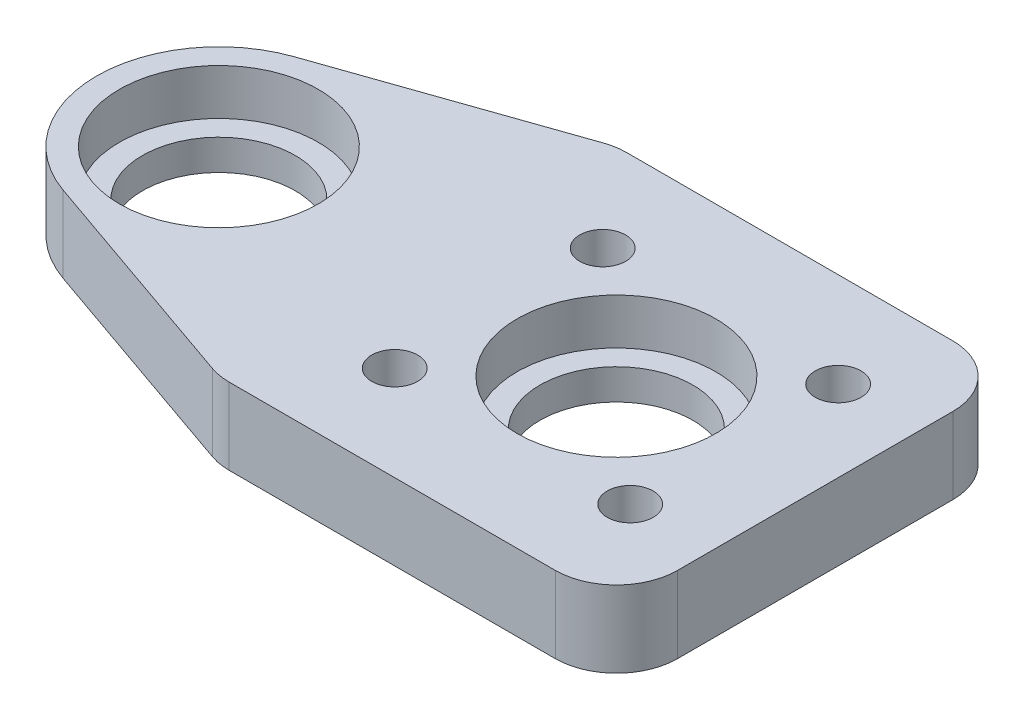
ISO-10303-21;
HEADER;
FILE_DESCRIPTION(('STEP AP214'),'2;1');
FILE_NAME('part.step','',(''),(''),'','','');
FILE_SCHEMA(('AUTOMOTIVE_DESIGN { 1 0 10303 214 1 1 1 1 }'));
ENDSEC;
DATA;
#1=APPLICATION_CONTEXT('core data for automotive mechanical design processes');
#2=APPLICATION_PROTOCOL_DEFINITION('international standard','automotive_design',2000,#1);
#3=PRODUCT_CONTEXT('',#1,'mechanical');
#4=PRODUCT('Part','Part','',(#3));
#5=PRODUCT_RELATED_PRODUCT_CATEGORY('part','',(#4));
#6=PRODUCT_DEFINITION_FORMATION('','',#4);
#7=PRODUCT_DEFINITION_CONTEXT('part definition',#1,'design');
#8=PRODUCT_DEFINITION('design','',#6,#7);
#9=PRODUCT_DEFINITION_SHAPE('','',#8);
#10=(LENGTH_UNIT() NAMED_UNIT(*) SI_UNIT(.MILLI.,.METRE.));
#11=(NAMED_UNIT(*) PLANE_ANGLE_UNIT() SI_UNIT($,.RADIAN.));
#12=(NAMED_UNIT(*) SI_UNIT($,.STERADIAN.) SOLID_ANGLE_UNIT());
#13=UNCERTAINTY_MEASURE_WITH_UNIT(LENGTH_MEASURE(1.E-05),#10,'distance_accuracy_value','');
#14=(GEOMETRIC_REPRESENTATION_CONTEXT(3) GLOBAL_UNCERTAINTY_ASSIGNED_CONTEXT((#13)) GLOBAL_UNIT_ASSIGNED_CONTEXT((#10,
#11,#12)) REPRESENTATION_CONTEXT('',''));
#15=CARTESIAN_POINT('',(0.,0.,0.));
#16=DIRECTION('',(0.,0.,1.));
#17=DIRECTION('',(1.,0.,0.));
#18=AXIS2_PLACEMENT_3D('',#15,#16,#17);
#19=CARTESIAN_POINT('',(-489.11106294102,-180.809804520672,-89.302859510669));
#20=DIRECTION('',(0.,-1.,0.));
#21=DIRECTION('',(0.,0.,-1.));
#22=AXIS2_PLACEMENT_3D('',#19,#20,#21);
#23=CYLINDRICAL_SURFACE('',#22,4.99999999999999);
#24=CARTESIAN_POINT('',(-489.11106294102,-185.809804520672,-89.302859510669));
#25=DIRECTION('',(0.,1.,0.));
#26=DIRECTION('',(0.,0.,1.));
#27=AXIS2_PLACEMENT_3D('',#24,#25,#26);
#28=CIRCLE('',#27,4.99999999999999);
#29=CARTESIAN_POINT('',(-489.11106294102,-185.809804520672,-84.302859510669));
#30=VERTEX_POINT('',#29);
#31=EDGE_CURVE('E163',#30,#30,#28,.T.);
#32=ORIENTED_EDGE('',*,*,#31,.F.);
#33=EDGE_LOOP('',(#32));
#34=FACE_BOUND('',#33,.T.);
#35=CARTESIAN_POINT('',(-489.11106294102,-183.809804520672,-89.302859510669));
#36=DIRECTION('',(0.,1.,0.));
#37=DIRECTION('',(0.,0.,1.));
#38=AXIS2_PLACEMENT_3D('',#35,#36,#37);
#39=CIRCLE('',#38,4.99999999999999);
#40=CARTESIAN_POINT('',(-489.11106294102,-183.809804520672,-84.302859510669));
#41=VERTEX_POINT('',#40);
#42=EDGE_CURVE('E165',#41,#41,#39,.T.);
#43=ORIENTED_EDGE('',*,*,#42,.T.);
#44=EDGE_LOOP('',(#43));
#45=FACE_BOUND('',#44,.T.);
#46=ADVANCED_FACE('F35',(#34,#45),#23,.F.);
#47=CARTESIAN_POINT('',(-463.11106294102,-180.809804520672,-89.302859510669));
#48=DIRECTION('',(0.,-1.,0.));
#49=DIRECTION('',(0.,0.,-1.));
#50=AXIS2_PLACEMENT_3D('',#47,#48,#49);
#51=CYLINDRICAL_SURFACE('',#50,4.99999999999999);
#52=CARTESIAN_POINT('',(-463.11106294102,-185.809804520672,-89.302859510669));
#53=DIRECTION('',(0.,1.,0.));
#54=DIRECTION('',(0.,0.,1.));
#55=AXIS2_PLACEMENT_3D('',#52,#53,#54);
#56=CIRCLE('',#55,4.99999999999999);
#57=CARTESIAN_POINT('',(-463.11106294102,-185.809804520672,-84.302859510669));
#58=VERTEX_POINT('',#57);
#59=EDGE_CURVE('E247',#58,#58,#56,.T.);
#60=ORIENTED_EDGE('',*,*,#59,.F.);
#61=EDGE_LOOP('',(#60));
#62=FACE_BOUND('',#61,.T.);
#63=CARTESIAN_POINT('',(-463.11106294102,-183.809804520672,-89.302859510669));
#64=DIRECTION('',(0.,1.,0.));
#65=DIRECTION('',(0.,0.,1.));
#66=AXIS2_PLACEMENT_3D('',#63,#64,#65);
#67=CIRCLE('',#66,4.99999999999999);
#68=CARTESIAN_POINT('',(-463.11106294102,-183.809804520672,-84.302859510669));
#69=VERTEX_POINT('',#68);
#70=EDGE_CURVE('E160',#69,#69,#67,.T.);
#71=ORIENTED_EDGE('',*,*,#70,.T.);
#72=EDGE_LOOP('',(#71));
#73=FACE_BOUND('',#72,.T.);
#74=ADVANCED_FACE('F275',(#62,#73),#51,.F.);
#75=CARTESIAN_POINT('',(-489.11106294102,-180.809804520672,-89.302859510669));
#76=DIRECTION('',(0.,-1.,0.));
#77=DIRECTION('',(0.,0.,-1.));
#78=AXIS2_PLACEMENT_3D('',#75,#76,#77);
#79=PLANE('',#78);
#80=CARTESIAN_POINT('',(-489.11106294102,-180.809804520672,-89.302859510669));
#81=DIRECTION('',(0.,1.,0.));
#82=DIRECTION('',(0.,0.,1.));
#83=AXIS2_PLACEMENT_3D('',#80,#81,#82);
#84=CIRCLE('',#83,6.50000000000002);
#85=CARTESIAN_POINT('',(-489.11106294102,-180.809804520672,-82.802859510669));
#86=VERTEX_POINT('',#85);
#87=EDGE_CURVE('E258',#86,#86,#84,.T.);
#88=ORIENTED_EDGE('',*,*,#87,.F.);
#89=EDGE_LOOP('',(#88));
#90=FACE_BOUND('',#89,.T.);
#91=CARTESIAN_POINT('',(-463.11106294102,-180.809804520672,-89.302859510669));
#92=DIRECTION('',(0.,1.,0.));
#93=DIRECTION('',(0.,0.,1.));
#94=AXIS2_PLACEMENT_3D('',#91,#92,#93);
#95=CIRCLE('',#94,6.50000000000002);
#96=CARTESIAN_POINT('',(-463.11106294102,-180.809804520672,-82.802859510669));
#97=VERTEX_POINT('',#96);
#98=EDGE_CURVE('E168',#97,#97,#95,.T.);
#99=ORIENTED_EDGE('',*,*,#98,.F.);
#100=EDGE_LOOP('',(#99));
#101=FACE_BOUND('',#100,.T.);
#102=DIRECTION('',(-1.,0.,0.));
#103=VECTOR('',#102,1.);
#104=CARTESIAN_POINT('',(-476.11106294102,-180.809804520672,-102.302859510669));
#105=LINE('',#104,#103);
#106=CARTESIAN_POINT('',(-454.11106294102,-180.809804520672,-102.302859510669));
#107=VERTEX_POINT('',#106);
#108=CARTESIAN_POINT('',(-475.434292764384,-180.809804520672,-102.302859510669));
#109=VERTEX_POINT('',#108);
#110=EDGE_CURVE('E125',#107,#109,#105,.T.);
#111=ORIENTED_EDGE('',*,*,#110,.T.);
#112=CARTESIAN_POINT('',(-475.434292764384,-180.809804520672,-98.302859510669));
#113=DIRECTION('',(0.,-1.,0.));
#114=DIRECTION('',(0.,0.,-1.));
#115=AXIS2_PLACEMENT_3D('',#112,#113,#114);
#116=CIRCLE('',#115,4.);
#117=CARTESIAN_POINT('',(-476.750164810507,-180.809804520672,-102.080223771398));
#118=VERTEX_POINT('',#117);
#119=EDGE_CURVE('E121',#109,#118,#116,.F.);
#120=ORIENTED_EDGE('',*,*,#119,.T.);
#121=DIRECTION('',(-0.944341065182142,0.,0.328968011530997));
#122=VECTOR('',#121,1.);
#123=CARTESIAN_POINT('',(-476.11106294102,-180.809804520672,-102.302859510669));
#124=LINE('',#123,#122);
#125=CARTESIAN_POINT('',(-491.742757588541,-180.809804520672,-96.85744609527));
#126=VERTEX_POINT('',#125);
#127=EDGE_CURVE('E111',#118,#126,#124,.T.);
#128=ORIENTED_EDGE('',*,*,#127,.T.);
#129=CARTESIAN_POINT('',(-489.11106294102,-180.809804520672,-89.302859510669));
#130=DIRECTION('',(0.,1.,0.));
#131=DIRECTION('',(0.,0.,-1.));
#132=AXIS2_PLACEMENT_3D('',#129,#130,#131);
#133=CIRCLE('',#132,7.99984969746488);
#134=CARTESIAN_POINT('',(-491.742757588541,-180.809804520672,-81.748272926068));
#135=VERTEX_POINT('',#134);
#136=EDGE_CURVE('E118',#126,#135,#133,.T.);
#137=ORIENTED_EDGE('',*,*,#136,.T.);
#138=DIRECTION('',(0.944341065182142,0.,0.328968011530997));
#139=VECTOR('',#138,1.);
#140=CARTESIAN_POINT('',(-476.11106294102,-180.809804520672,-76.302859510669));
#141=LINE('',#140,#139);
#142=CARTESIAN_POINT('',(-476.750164810507,-180.809804520672,-76.5254952499404));
#143=VERTEX_POINT('',#142);
#144=EDGE_CURVE('E158',#135,#143,#141,.T.);
#145=ORIENTED_EDGE('',*,*,#144,.T.);
#146=CARTESIAN_POINT('',(-475.434292764384,-180.809804520672,-80.302859510669));
#147=DIRECTION('',(0.,-1.,0.));
#148=DIRECTION('',(0.,0.,-1.));
#149=AXIS2_PLACEMENT_3D('',#146,#147,#148);
#150=CIRCLE('',#149,4.);
#151=CARTESIAN_POINT('',(-475.434292764384,-180.809804520672,-76.302859510669));
#152=VERTEX_POINT('',#151);
#153=EDGE_CURVE('E184',#143,#152,#150,.F.);
#154=ORIENTED_EDGE('',*,*,#153,.T.);
#155=DIRECTION('',(1.,0.,0.));
#156=VECTOR('',#155,1.);
#157=CARTESIAN_POINT('',(-450.11106294102,-180.809804520672,-76.302859510669));
#158=LINE('',#157,#156);
#159=CARTESIAN_POINT('',(-454.11106294102,-180.809804520672,-76.302859510669));
#160=VERTEX_POINT('',#159);
#161=EDGE_CURVE('E200',#152,#160,#158,.T.);
#162=ORIENTED_EDGE('',*,*,#161,.T.);
#163=CARTESIAN_POINT('',(-454.11106294102,-180.809804520672,-80.302859510669));
#164=DIRECTION('',(0.,-1.,0.));
#165=DIRECTION('',(0.,0.,-1.));
#166=AXIS2_PLACEMENT_3D('',#163,#164,#165);
#167=CIRCLE('',#166,4.);
#168=CARTESIAN_POINT('',(-450.11106294102,-180.809804520672,-80.302859510669));
#169=VERTEX_POINT('',#168);
#170=EDGE_CURVE('E57',#160,#169,#167,.F.);
#171=ORIENTED_EDGE('',*,*,#170,.T.);
#172=DIRECTION('',(0.,0.,-1.));
#173=VECTOR('',#172,1.);
#174=CARTESIAN_POINT('',(-450.11106294102,-180.809804520672,-89.302859510669));
#175=LINE('',#174,#173);
#176=CARTESIAN_POINT('',(-450.11106294102,-180.809804520672,-98.302859510669));
#177=VERTEX_POINT('',#176);
#178=EDGE_CURVE('E205',#169,#177,#175,.T.);
#179=ORIENTED_EDGE('',*,*,#178,.T.);
#180=CARTESIAN_POINT('',(-454.11106294102,-180.809804520672,-98.302859510669));
#181=DIRECTION('',(0.,-1.,0.));
#182=DIRECTION('',(0.,0.,-1.));
#183=AXIS2_PLACEMENT_3D('',#180,#181,#182);
#184=CIRCLE('',#183,4.);
#185=EDGE_CURVE('E187',#177,#107,#184,.F.);
#186=ORIENTED_EDGE('',*,*,#185,.T.);
#187=EDGE_LOOP('',(#111,#120,#128,#137,#145,#154,#162,#171,#179,#186));
#188=FACE_BOUND('',#187,.T.);
#189=CARTESIAN_POINT('',(-470.81106294102,-180.809804520672,-96.102859510669));
#190=DIRECTION('',(0.,1.,0.));
#191=DIRECTION('',(0.,0.,1.));
#192=AXIS2_PLACEMENT_3D('',#189,#190,#191);
#193=CIRCLE('',#192,1.50000000000002);
#194=CARTESIAN_POINT('',(-470.81106294102,-180.809804520672,-94.602859510669));
#195=VERTEX_POINT('',#194);
#196=EDGE_CURVE('E148',#195,#195,#193,.T.);
#197=ORIENTED_EDGE('',*,*,#196,.F.);
#198=EDGE_LOOP('',(#197));
#199=FACE_BOUND('',#198,.T.);
#200=CARTESIAN_POINT('',(-455.41106294102,-180.809804520672,-96.102859510669));
#201=DIRECTION('',(0.,1.,0.));
#202=DIRECTION('',(0.,0.,1.));
#203=AXIS2_PLACEMENT_3D('',#200,#201,#202);
#204=CIRCLE('',#203,1.49999999999997);
#205=CARTESIAN_POINT('',(-455.41106294102,-180.809804520672,-94.602859510669));
#206=VERTEX_POINT('',#205);
#207=EDGE_CURVE('E229',#206,#206,#204,.T.);
#208=ORIENTED_EDGE('',*,*,#207,.F.);
#209=EDGE_LOOP('',(#208));
#210=FACE_BOUND('',#209,.T.);
#211=CARTESIAN_POINT('',(-455.41106294102,-180.809804520672,-82.502859510669));
#212=DIRECTION('',(0.,1.,0.));
#213=DIRECTION('',(0.,0.,1.));
#214=AXIS2_PLACEMENT_3D('',#211,#212,#213);
#215=CIRCLE('',#214,1.50000000000002);
#216=CARTESIAN_POINT('',(-455.41106294102,-180.809804520672,-81.002859510669));
#217=VERTEX_POINT('',#216);
#218=EDGE_CURVE('E235',#217,#217,#215,.T.);
#219=ORIENTED_EDGE('',*,*,#218,.F.);
#220=EDGE_LOOP('',(#219));
#221=FACE_BOUND('',#220,.T.);
#222=CARTESIAN_POINT('',(-470.81106294102,-180.809804520672,-82.502859510669));
#223=DIRECTION('',(0.,1.,0.));
#224=DIRECTION('',(0.,0.,1.));
#225=AXIS2_PLACEMENT_3D('',#222,#223,#224);
#226=CIRCLE('',#225,1.50000000000002);
#227=CARTESIAN_POINT('',(-470.81106294102,-180.809804520672,-81.002859510669));
#228=VERTEX_POINT('',#227);
#229=EDGE_CURVE('E241',#228,#228,#226,.T.);
#230=ORIENTED_EDGE('',*,*,#229,.F.);
#231=EDGE_LOOP('',(#230));
#232=FACE_BOUND('',#231,.T.);
#233=ADVANCED_FACE('F114',(#90,#101,#188,#199,#210,#221,#232),#79,.F.);
#234=CARTESIAN_POINT('',(-489.11106294102,-185.809804520672,-89.302859510669));
#235=DIRECTION('',(0.,-1.,0.));
#236=DIRECTION('',(0.,0.,-1.));
#237=AXIS2_PLACEMENT_3D('',#234,#235,#236);
#238=PLANE('',#237);
#239=ORIENTED_EDGE('',*,*,#59,.T.);
#240=EDGE_LOOP('',(#239));
#241=FACE_BOUND('',#240,.T.);
#242=CARTESIAN_POINT('',(-455.41106294102,-185.809804520672,-82.502859510669));
#243=DIRECTION('',(0.,1.,0.));
#244=DIRECTION('',(0.,0.,1.));
#245=AXIS2_PLACEMENT_3D('',#242,#243,#244);
#246=CIRCLE('',#245,1.50000000000002);
#247=CARTESIAN_POINT('',(-455.41106294102,-185.809804520672,-81.002859510669));
#248=VERTEX_POINT('',#247);
#249=EDGE_CURVE('E238',#248,#248,#246,.T.);
#250=ORIENTED_EDGE('',*,*,#249,.T.);
#251=EDGE_LOOP('',(#250));
#252=FACE_BOUND('',#251,.T.);
#253=CARTESIAN_POINT('',(-470.81106294102,-185.809804520672,-96.102859510669));
#254=DIRECTION('',(0.,1.,0.));
#255=DIRECTION('',(0.,0.,1.));
#256=AXIS2_PLACEMENT_3D('',#253,#254,#255);
#257=CIRCLE('',#256,1.50000000000002);
#258=CARTESIAN_POINT('',(-470.81106294102,-185.809804520672,-94.602859510669));
#259=VERTEX_POINT('',#258);
#260=EDGE_CURVE('E226',#259,#259,#257,.T.);
#261=ORIENTED_EDGE('',*,*,#260,.T.);
#262=EDGE_LOOP('',(#261));
#263=FACE_BOUND('',#262,.T.);
#264=DIRECTION('',(-0.944341065182142,0.,0.328968011530997));
#265=VECTOR('',#264,1.);
#266=CARTESIAN_POINT('',(-476.11106294102,-185.809804520672,-102.302859510669));
#267=LINE('',#266,#265);
#268=CARTESIAN_POINT('',(-476.750164810507,-185.809804520672,-102.080223771398));
#269=VERTEX_POINT('',#268);
#270=CARTESIAN_POINT('',(-491.742757588541,-185.809804520672,-96.85744609527));
#271=VERTEX_POINT('',#270);
#272=EDGE_CURVE('E131',#269,#271,#267,.T.);
#273=ORIENTED_EDGE('',*,*,#272,.F.);
#274=CARTESIAN_POINT('',(-475.434292764384,-185.809804520672,-98.302859510669));
#275=DIRECTION('',(0.,-1.,0.));
#276=DIRECTION('',(0.,0.,-1.));
#277=AXIS2_PLACEMENT_3D('',#274,#275,#276);
#278=CIRCLE('',#277,4.);
#279=CARTESIAN_POINT('',(-475.434292764384,-185.809804520672,-102.302859510669));
#280=VERTEX_POINT('',#279);
#281=EDGE_CURVE('E177',#269,#280,#278,.T.);
#282=ORIENTED_EDGE('',*,*,#281,.T.);
#283=DIRECTION('',(-1.,0.,0.));
#284=VECTOR('',#283,1.);
#285=CARTESIAN_POINT('',(-476.11106294102,-185.809804520672,-102.302859510669));
#286=LINE('',#285,#284);
#287=CARTESIAN_POINT('',(-454.11106294102,-185.809804520672,-102.302859510669));
#288=VERTEX_POINT('',#287);
#289=EDGE_CURVE('E153',#288,#280,#286,.T.);
#290=ORIENTED_EDGE('',*,*,#289,.F.);
#291=CARTESIAN_POINT('',(-454.11106294102,-185.809804520672,-98.302859510669));
#292=DIRECTION('',(0.,-1.,0.));
#293=DIRECTION('',(0.,0.,-1.));
#294=AXIS2_PLACEMENT_3D('',#291,#292,#293);
#295=CIRCLE('',#294,4.);
#296=CARTESIAN_POINT('',(-450.11106294102,-185.809804520672,-98.302859510669));
#297=VERTEX_POINT('',#296);
#298=EDGE_CURVE('E175',#288,#297,#295,.T.);
#299=ORIENTED_EDGE('',*,*,#298,.T.);
#300=DIRECTION('',(0.,0.,-1.));
#301=VECTOR('',#300,1.);
#302=CARTESIAN_POINT('',(-450.11106294102,-185.809804520672,-102.302859510669));
#303=LINE('',#302,#301);
#304=CARTESIAN_POINT('',(-450.11106294102,-185.809804520672,-80.302859510669));
#305=VERTEX_POINT('',#304);
#306=EDGE_CURVE('E151',#305,#297,#303,.T.);
#307=ORIENTED_EDGE('',*,*,#306,.F.);
#308=CARTESIAN_POINT('',(-454.11106294102,-185.809804520672,-80.302859510669));
#309=DIRECTION('',(0.,-1.,0.));
#310=DIRECTION('',(0.,0.,-1.));
#311=AXIS2_PLACEMENT_3D('',#308,#309,#310);
#312=CIRCLE('',#311,4.);
#313=CARTESIAN_POINT('',(-454.11106294102,-185.809804520672,-76.302859510669));
#314=VERTEX_POINT('',#313);
#315=EDGE_CURVE('E173',#305,#314,#312,.T.);
#316=ORIENTED_EDGE('',*,*,#315,.T.);
#317=DIRECTION('',(1.,0.,0.));
#318=VECTOR('',#317,1.);
#319=CARTESIAN_POINT('',(-450.11106294102,-185.809804520672,-76.302859510669));
#320=LINE('',#319,#318);
#321=CARTESIAN_POINT('',(-475.434292764384,-185.809804520672,-76.302859510669));
#322=VERTEX_POINT('',#321);
#323=EDGE_CURVE('E147',#322,#314,#320,.T.);
#324=ORIENTED_EDGE('',*,*,#323,.F.);
#325=CARTESIAN_POINT('',(-475.434292764384,-185.809804520672,-80.302859510669));
#326=DIRECTION('',(0.,-1.,0.));
#327=DIRECTION('',(0.,0.,-1.));
#328=AXIS2_PLACEMENT_3D('',#325,#326,#327);
#329=CIRCLE('',#328,4.);
#330=CARTESIAN_POINT('',(-476.750164810507,-185.809804520672,-76.5254952499404));
#331=VERTEX_POINT('',#330);
#332=EDGE_CURVE('E171',#322,#331,#329,.T.);
#333=ORIENTED_EDGE('',*,*,#332,.T.);
#334=DIRECTION('',(0.944341065182142,0.,0.328968011530997));
#335=VECTOR('',#334,1.);
#336=CARTESIAN_POINT('',(-476.11106294102,-185.809804520672,-76.302859510669));
#337=LINE('',#336,#335);
#338=CARTESIAN_POINT('',(-491.742757588541,-185.809804520672,-81.748272926068));
#339=VERTEX_POINT('',#338);
#340=EDGE_CURVE('E144',#339,#331,#337,.T.);
#341=ORIENTED_EDGE('',*,*,#340,.F.);
#342=CARTESIAN_POINT('',(-489.11106294102,-185.809804520672,-89.302859510669));
#343=DIRECTION('',(0.,1.,0.));
#344=DIRECTION('',(0.,0.,-1.));
#345=AXIS2_PLACEMENT_3D('',#342,#343,#344);
#346=CIRCLE('',#345,7.99984969746488);
#347=EDGE_CURVE('E157',#271,#339,#346,.T.);
#348=ORIENTED_EDGE('',*,*,#347,.F.);
#349=EDGE_LOOP('',(#273,#282,#290,#299,#307,#316,#324,#333,#341,#348));
#350=FACE_BOUND('',#349,.T.);
#351=CARTESIAN_POINT('',(-455.41106294102,-185.809804520672,-96.102859510669));
#352=DIRECTION('',(0.,1.,0.));
#353=DIRECTION('',(0.,0.,1.));
#354=AXIS2_PLACEMENT_3D('',#351,#352,#353);
#355=CIRCLE('',#354,1.49999999999997);
#356=CARTESIAN_POINT('',(-455.41106294102,-185.809804520672,-94.602859510669));
#357=VERTEX_POINT('',#356);
#358=EDGE_CURVE('E232',#357,#357,#355,.T.);
#359=ORIENTED_EDGE('',*,*,#358,.T.);
#360=EDGE_LOOP('',(#359));
#361=FACE_BOUND('',#360,.T.);
#362=CARTESIAN_POINT('',(-470.81106294102,-185.809804520672,-82.502859510669));
#363=DIRECTION('',(0.,1.,0.));
#364=DIRECTION('',(0.,0.,1.));
#365=AXIS2_PLACEMENT_3D('',#362,#363,#364);
#366=CIRCLE('',#365,1.50000000000002);
#367=CARTESIAN_POINT('',(-470.81106294102,-185.809804520672,-81.002859510669));
#368=VERTEX_POINT('',#367);
#369=EDGE_CURVE('E244',#368,#368,#366,.T.);
#370=ORIENTED_EDGE('',*,*,#369,.T.);
#371=EDGE_LOOP('',(#370));
#372=FACE_BOUND('',#371,.T.);
#373=ORIENTED_EDGE('',*,*,#31,.T.);
#374=EDGE_LOOP('',(#373));
#375=FACE_BOUND('',#374,.T.);
#376=ADVANCED_FACE('F212',(#241,#252,#263,#350,#361,#372,#375),#238,.T.);
#377=CARTESIAN_POINT('',(-476.11106294102,-180.809804520672,-76.302859510669));
#378=DIRECTION('',(0.328968011530997,0.,-0.944341065182142));
#379=DIRECTION('',(-0.944341065182142,0.,-0.328968011530997));
#380=AXIS2_PLACEMENT_3D('',#377,#378,#379);
#381=PLANE('',#380);
#382=ORIENTED_EDGE('',*,*,#340,.T.);
#383=DIRECTION('',(0.,-1.,0.));
#384=VECTOR('',#383,1.);
#385=CARTESIAN_POINT('',(-476.750164810507,-180.809804520672,-76.5254952499404));
#386=LINE('',#385,#384);
#387=EDGE_CURVE('E11',#331,#143,#386,.F.);
#388=ORIENTED_EDGE('',*,*,#387,.T.);
#389=ORIENTED_EDGE('',*,*,#144,.F.);
#390=DIRECTION('',(0.,-1.,0.));
#391=VECTOR('',#390,1.);
#392=CARTESIAN_POINT('',(-491.742757588541,-180.809804520672,-81.748272926068));
#393=LINE('',#392,#391);
#394=EDGE_CURVE('E135',#135,#339,#393,.T.);
#395=ORIENTED_EDGE('',*,*,#394,.T.);
#396=EDGE_LOOP('',(#382,#388,#389,#395));
#397=FACE_BOUND('',#396,.T.);
#398=ADVANCED_FACE('F318',(#397),#381,.F.);
#399=CARTESIAN_POINT('',(-450.11106294102,-180.809804520672,-76.302859510669));
#400=DIRECTION('',(0.,0.,-1.));
#401=DIRECTION('',(-1.,0.,0.));
#402=AXIS2_PLACEMENT_3D('',#399,#400,#401);
#403=PLANE('',#402);
#404=ORIENTED_EDGE('',*,*,#323,.T.);
#405=DIRECTION('',(0.,-1.,0.));
#406=VECTOR('',#405,1.);
#407=CARTESIAN_POINT('',(-454.11106294102,-180.809804520672,-76.302859510669));
#408=LINE('',#407,#406);
#409=EDGE_CURVE('E43',#314,#160,#408,.F.);
#410=ORIENTED_EDGE('',*,*,#409,.T.);
#411=ORIENTED_EDGE('',*,*,#161,.F.);
#412=DIRECTION('',(0.,-1.,0.));
#413=VECTOR('',#412,1.);
#414=CARTESIAN_POINT('',(-475.434292764384,-180.809804520672,-76.302859510669));
#415=LINE('',#414,#413);
#416=EDGE_CURVE('E194',#152,#322,#415,.T.);
#417=ORIENTED_EDGE('',*,*,#416,.T.);
#418=EDGE_LOOP('',(#404,#410,#411,#417));
#419=FACE_BOUND('',#418,.T.);
#420=ADVANCED_FACE('F199',(#419),#403,.F.);
#421=CARTESIAN_POINT('',(-450.11106294102,-180.809804520672,-102.302859510669));
#422=DIRECTION('',(-1.,0.,0.));
#423=DIRECTION('',(0.,0.,1.));
#424=AXIS2_PLACEMENT_3D('',#421,#422,#423);
#425=PLANE('',#424);
#426=ORIENTED_EDGE('',*,*,#306,.T.);
#427=DIRECTION('',(0.,-1.,0.));
#428=VECTOR('',#427,1.);
#429=CARTESIAN_POINT('',(-450.11106294102,-180.809804520672,-98.302859510669));
#430=LINE('',#429,#428);
#431=EDGE_CURVE('E50',#297,#177,#430,.F.);
#432=ORIENTED_EDGE('',*,*,#431,.T.);
#433=ORIENTED_EDGE('',*,*,#178,.F.);
#434=DIRECTION('',(0.,-1.,0.));
#435=VECTOR('',#434,1.);
#436=CARTESIAN_POINT('',(-450.11106294102,-180.809804520672,-80.302859510669));
#437=LINE('',#436,#435);
#438=EDGE_CURVE('E190',#169,#305,#437,.T.);
#439=ORIENTED_EDGE('',*,*,#438,.T.);
#440=EDGE_LOOP('',(#426,#432,#433,#439));
#441=FACE_BOUND('',#440,.T.);
#442=ADVANCED_FACE('F210',(#441),#425,.F.);
#443=CARTESIAN_POINT('',(-476.11106294102,-180.809804520672,-102.302859510669));
#444=DIRECTION('',(0.,0.,1.));
#445=DIRECTION('',(1.,0.,0.));
#446=AXIS2_PLACEMENT_3D('',#443,#444,#445);
#447=PLANE('',#446);
#448=ORIENTED_EDGE('',*,*,#289,.T.);
#449=DIRECTION('',(0.,-1.,0.));
#450=VECTOR('',#449,1.);
#451=CARTESIAN_POINT('',(-475.434292764384,-180.809804520672,-102.302859510669));
#452=LINE('',#451,#450);
#453=EDGE_CURVE('E182',#280,#109,#452,.F.);
#454=ORIENTED_EDGE('',*,*,#453,.T.);
#455=ORIENTED_EDGE('',*,*,#110,.F.);
#456=DIRECTION('',(0.,-1.,0.));
#457=VECTOR('',#456,1.);
#458=CARTESIAN_POINT('',(-454.11106294102,-180.809804520672,-102.302859510669));
#459=LINE('',#458,#457);
#460=EDGE_CURVE('E179',#107,#288,#459,.T.);
#461=ORIENTED_EDGE('',*,*,#460,.T.);
#462=EDGE_LOOP('',(#448,#454,#455,#461));
#463=FACE_BOUND('',#462,.T.);
#464=ADVANCED_FACE('F221',(#463),#447,.F.);
#465=CARTESIAN_POINT('',(-476.11106294102,-180.809804520672,-102.302859510669));
#466=DIRECTION('',(0.328968011530997,0.,0.944341065182142));
#467=DIRECTION('',(0.944341065182142,0.,-0.328968011530997));
#468=AXIS2_PLACEMENT_3D('',#465,#466,#467);
#469=PLANE('',#468);
#470=ORIENTED_EDGE('',*,*,#127,.F.);
#471=DIRECTION('',(0.,-1.,0.));
#472=VECTOR('',#471,1.);
#473=CARTESIAN_POINT('',(-476.750164810507,-180.809804520672,-102.080223771398));
#474=LINE('',#473,#472);
#475=EDGE_CURVE('E134',#118,#269,#474,.T.);
#476=ORIENTED_EDGE('',*,*,#475,.T.);
#477=ORIENTED_EDGE('',*,*,#272,.T.);
#478=DIRECTION('',(0.,-1.,0.));
#479=VECTOR('',#478,1.);
#480=CARTESIAN_POINT('',(-491.742757588541,-180.809804520672,-96.85744609527));
#481=LINE('',#480,#479);
#482=EDGE_CURVE('E128',#126,#271,#481,.T.);
#483=ORIENTED_EDGE('',*,*,#482,.F.);
#484=EDGE_LOOP('',(#470,#476,#477,#483));
#485=FACE_BOUND('',#484,.T.);
#486=ADVANCED_FACE('F129',(#485),#469,.F.);
#487=CARTESIAN_POINT('',(-489.11106294102,-180.809804520672,-89.302859510669));
#488=DIRECTION('',(0.,-1.,0.));
#489=DIRECTION('',(0.,0.,-1.));
#490=AXIS2_PLACEMENT_3D('',#487,#488,#489);
#491=CYLINDRICAL_SURFACE('',#490,7.99984969746488);
#492=ORIENTED_EDGE('',*,*,#347,.T.);
#493=ORIENTED_EDGE('',*,*,#394,.F.);
#494=ORIENTED_EDGE('',*,*,#136,.F.);
#495=ORIENTED_EDGE('',*,*,#482,.T.);
#496=EDGE_LOOP('',(#492,#493,#494,#495));
#497=FACE_BOUND('',#496,.T.);
#498=ADVANCED_FACE('F137',(#497),#491,.T.);
#499=CARTESIAN_POINT('',(-470.81106294102,-180.809804520672,-96.102859510669));
#500=DIRECTION('',(0.,-1.,0.));
#501=DIRECTION('',(0.,0.,-1.));
#502=AXIS2_PLACEMENT_3D('',#499,#500,#501);
#503=CYLINDRICAL_SURFACE('',#502,1.50000000000002);
#504=ORIENTED_EDGE('',*,*,#196,.T.);
#505=EDGE_LOOP('',(#504));
#506=FACE_BOUND('',#505,.T.);
#507=ORIENTED_EDGE('',*,*,#260,.F.);
#508=EDGE_LOOP('',(#507));
#509=FACE_BOUND('',#508,.T.);
#510=ADVANCED_FACE('F311',(#506,#509),#503,.F.);
#511=CARTESIAN_POINT('',(-455.41106294102,-180.809804520672,-96.102859510669));
#512=DIRECTION('',(0.,-1.,0.));
#513=DIRECTION('',(0.,0.,-1.));
#514=AXIS2_PLACEMENT_3D('',#511,#512,#513);
#515=CYLINDRICAL_SURFACE('',#514,1.49999999999997);
#516=ORIENTED_EDGE('',*,*,#207,.T.);
#517=EDGE_LOOP('',(#516));
#518=FACE_BOUND('',#517,.T.);
#519=ORIENTED_EDGE('',*,*,#358,.F.);
#520=EDGE_LOOP('',(#519));
#521=FACE_BOUND('',#520,.T.);
#522=ADVANCED_FACE('F307',(#518,#521),#515,.F.);
#523=CARTESIAN_POINT('',(-455.41106294102,-180.809804520672,-82.502859510669));
#524=DIRECTION('',(0.,-1.,0.));
#525=DIRECTION('',(0.,0.,-1.));
#526=AXIS2_PLACEMENT_3D('',#523,#524,#525);
#527=CYLINDRICAL_SURFACE('',#526,1.50000000000002);
#528=ORIENTED_EDGE('',*,*,#218,.T.);
#529=EDGE_LOOP('',(#528));
#530=FACE_BOUND('',#529,.T.);
#531=ORIENTED_EDGE('',*,*,#249,.F.);
#532=EDGE_LOOP('',(#531));
#533=FACE_BOUND('',#532,.T.);
#534=ADVANCED_FACE('F290',(#530,#533),#527,.F.);
#535=CARTESIAN_POINT('',(-470.81106294102,-180.809804520672,-82.502859510669));
#536=DIRECTION('',(0.,-1.,0.));
#537=DIRECTION('',(0.,0.,-1.));
#538=AXIS2_PLACEMENT_3D('',#535,#536,#537);
#539=CYLINDRICAL_SURFACE('',#538,1.50000000000002);
#540=ORIENTED_EDGE('',*,*,#229,.T.);
#541=EDGE_LOOP('',(#540));
#542=FACE_BOUND('',#541,.T.);
#543=ORIENTED_EDGE('',*,*,#369,.F.);
#544=EDGE_LOOP('',(#543));
#545=FACE_BOUND('',#544,.T.);
#546=ADVANCED_FACE('F281',(#542,#545),#539,.F.);
#547=CARTESIAN_POINT('',(-463.11106294102,-183.809804520672,-89.302859510669));
#548=DIRECTION('',(0.,1.,0.));
#549=DIRECTION('',(0.,0.,1.));
#550=AXIS2_PLACEMENT_3D('',#547,#548,#549);
#551=CYLINDRICAL_SURFACE('',#550,6.50000000000002);
#552=CARTESIAN_POINT('',(-463.11106294102,-183.809804520672,-89.302859510669));
#553=DIRECTION('',(0.,1.,0.));
#554=DIRECTION('',(0.,0.,1.));
#555=AXIS2_PLACEMENT_3D('',#552,#553,#554);
#556=CIRCLE('',#555,6.50000000000002);
#557=CARTESIAN_POINT('',(-463.11106294102,-183.809804520672,-82.802859510669));
#558=VERTEX_POINT('',#557);
#559=EDGE_CURVE('E164',#558,#558,#556,.T.);
#560=ORIENTED_EDGE('',*,*,#559,.F.);
#561=EDGE_LOOP('',(#560));
#562=FACE_BOUND('',#561,.T.);
#563=ORIENTED_EDGE('',*,*,#98,.T.);
#564=EDGE_LOOP('',(#563));
#565=FACE_BOUND('',#564,.T.);
#566=ADVANCED_FACE('F279',(#562,#565),#551,.F.);
#567=CARTESIAN_POINT('',(-463.11106294102,-183.809804520672,-89.302859510669));
#568=DIRECTION('',(0.,1.,0.));
#569=DIRECTION('',(0.,0.,1.));
#570=AXIS2_PLACEMENT_3D('',#567,#568,#569);
#571=PLANE('',#570);
#572=ORIENTED_EDGE('',*,*,#70,.F.);
#573=EDGE_LOOP('',(#572));
#574=FACE_BOUND('',#573,.T.);
#575=ORIENTED_EDGE('',*,*,#559,.T.);
#576=EDGE_LOOP('',(#575));
#577=FACE_BOUND('',#576,.T.);
#578=ADVANCED_FACE('F269',(#574,#577),#571,.T.);
#579=CARTESIAN_POINT('',(-489.11106294102,-183.809804520672,-89.302859510669));
#580=DIRECTION('',(0.,1.,0.));
#581=DIRECTION('',(0.,0.,1.));
#582=AXIS2_PLACEMENT_3D('',#579,#580,#581);
#583=CYLINDRICAL_SURFACE('',#582,6.50000000000002);
#584=CARTESIAN_POINT('',(-489.11106294102,-183.809804520672,-89.302859510669));
#585=DIRECTION('',(0.,1.,0.));
#586=DIRECTION('',(0.,0.,1.));
#587=AXIS2_PLACEMENT_3D('',#584,#585,#586);
#588=CIRCLE('',#587,6.50000000000002);
#589=CARTESIAN_POINT('',(-489.11106294102,-183.809804520672,-82.802859510669));
#590=VERTEX_POINT('',#589);
#591=EDGE_CURVE('E169',#590,#590,#588,.T.);
#592=ORIENTED_EDGE('',*,*,#591,.F.);
#593=EDGE_LOOP('',(#592));
#594=FACE_BOUND('',#593,.T.);
#595=ORIENTED_EDGE('',*,*,#87,.T.);
#596=EDGE_LOOP('',(#595));
#597=FACE_BOUND('',#596,.T.);
#598=ADVANCED_FACE('F266',(#594,#597),#583,.F.);
#599=CARTESIAN_POINT('',(-489.11106294102,-183.809804520672,-89.302859510669));
#600=DIRECTION('',(0.,1.,0.));
#601=DIRECTION('',(0.,0.,1.));
#602=AXIS2_PLACEMENT_3D('',#599,#600,#601);
#603=PLANE('',#602);
#604=ORIENTED_EDGE('',*,*,#42,.F.);
#605=EDGE_LOOP('',(#604));
#606=FACE_BOUND('',#605,.T.);
#607=ORIENTED_EDGE('',*,*,#591,.T.);
#608=EDGE_LOOP('',(#607));
#609=FACE_BOUND('',#608,.T.);
#610=ADVANCED_FACE('F264',(#606,#609),#603,.T.);
#611=CARTESIAN_POINT('',(-475.434292764384,-180.809804520672,-98.302859510669));
#612=DIRECTION('',(0.,-1.,0.));
#613=DIRECTION('',(0.,0.,-1.));
#614=AXIS2_PLACEMENT_3D('',#611,#612,#613);
#615=CYLINDRICAL_SURFACE('',#614,4.);
#616=ORIENTED_EDGE('',*,*,#119,.F.);
#617=ORIENTED_EDGE('',*,*,#453,.F.);
#618=ORIENTED_EDGE('',*,*,#281,.F.);
#619=ORIENTED_EDGE('',*,*,#475,.F.);
#620=EDGE_LOOP('',(#616,#617,#618,#619));
#621=FACE_BOUND('',#620,.T.);
#622=ADVANCED_FACE('F333',(#621),#615,.T.);
#623=CARTESIAN_POINT('',(-454.11106294102,-180.809804520672,-98.302859510669));
#624=DIRECTION('',(0.,-1.,0.));
#625=DIRECTION('',(0.,0.,-1.));
#626=AXIS2_PLACEMENT_3D('',#623,#624,#625);
#627=CYLINDRICAL_SURFACE('',#626,4.);
#628=ORIENTED_EDGE('',*,*,#185,.F.);
#629=ORIENTED_EDGE('',*,*,#431,.F.);
#630=ORIENTED_EDGE('',*,*,#298,.F.);
#631=ORIENTED_EDGE('',*,*,#460,.F.);
#632=EDGE_LOOP('',(#628,#629,#630,#631));
#633=FACE_BOUND('',#632,.T.);
#634=ADVANCED_FACE('F218',(#633),#627,.T.);
#635=CARTESIAN_POINT('',(-454.11106294102,-180.809804520672,-80.302859510669));
#636=DIRECTION('',(0.,-1.,0.));
#637=DIRECTION('',(0.,0.,-1.));
#638=AXIS2_PLACEMENT_3D('',#635,#636,#637);
#639=CYLINDRICAL_SURFACE('',#638,4.);
#640=ORIENTED_EDGE('',*,*,#170,.F.);
#641=ORIENTED_EDGE('',*,*,#409,.F.);
#642=ORIENTED_EDGE('',*,*,#315,.F.);
#643=ORIENTED_EDGE('',*,*,#438,.F.);
#644=EDGE_LOOP('',(#640,#641,#642,#643));
#645=FACE_BOUND('',#644,.T.);
#646=ADVANCED_FACE('F208',(#645),#639,.T.);
#647=CARTESIAN_POINT('',(-475.434292764384,-180.809804520672,-80.302859510669));
#648=DIRECTION('',(0.,-1.,0.));
#649=DIRECTION('',(0.,0.,-1.));
#650=AXIS2_PLACEMENT_3D('',#647,#648,#649);
#651=CYLINDRICAL_SURFACE('',#650,4.);
#652=ORIENTED_EDGE('',*,*,#153,.F.);
#653=ORIENTED_EDGE('',*,*,#387,.F.);
#654=ORIENTED_EDGE('',*,*,#332,.F.);
#655=ORIENTED_EDGE('',*,*,#416,.F.);
#656=EDGE_LOOP('',(#652,#653,#654,#655));
#657=FACE_BOUND('',#656,.T.);
#658=ADVANCED_FACE('F37',(#657),#651,.T.);
#659=CLOSED_SHELL('',(#46,#74,#233,#376,#398,#420,#442,#464,#486,#498,#510,#522,#534,#546,#566,
#578,#598,#610,#622,#634,#646,#658));
#660=MANIFOLD_SOLID_BREP('B2',#659);
#661=ADVANCED_BREP_SHAPE_REPRESENTATION('',(#18,#660),#14);
#662=SHAPE_DEFINITION_REPRESENTATION(#9,#661);
ENDSEC;
END-ISO-10303-21;
